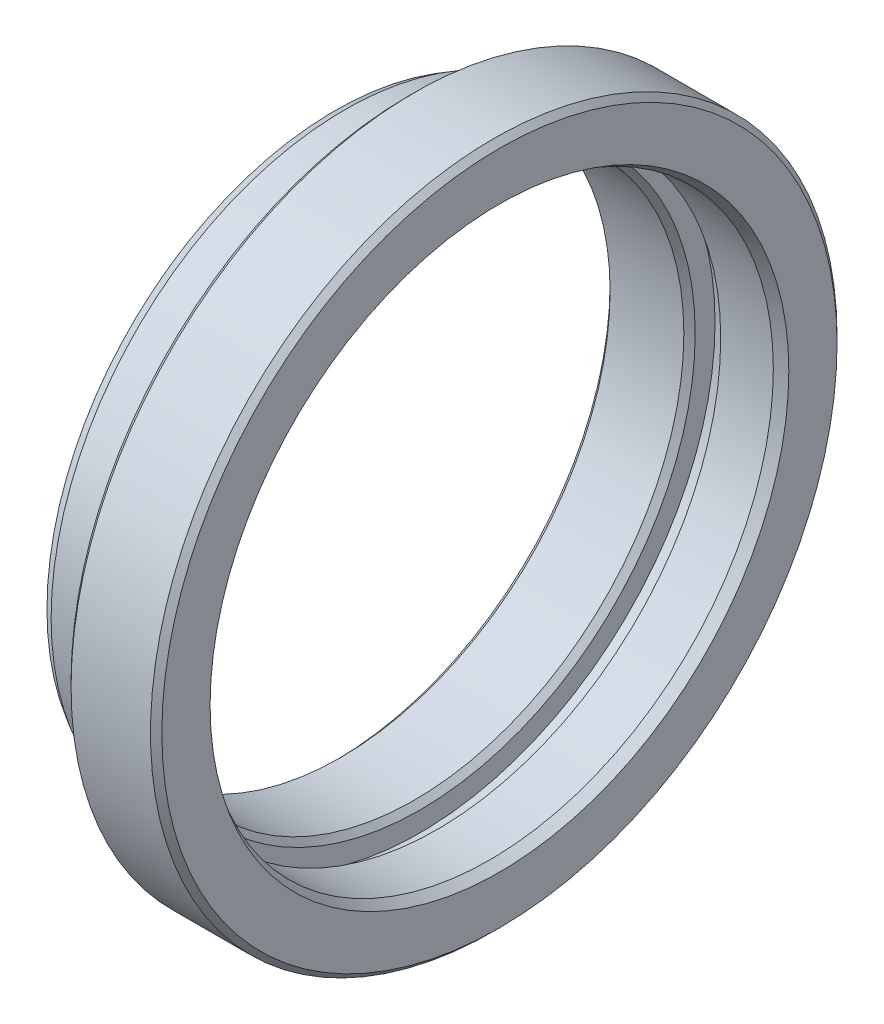
ISO-10303-21;
HEADER;
FILE_DESCRIPTION(('STEP AP214'),'2;1');
FILE_NAME('part.step','',(''),(''),'','','');
FILE_SCHEMA(('AUTOMOTIVE_DESIGN { 1 0 10303 214 1 1 1 1 }'));
ENDSEC;
DATA;
#1=APPLICATION_CONTEXT('core data for automotive mechanical design processes');
#2=APPLICATION_PROTOCOL_DEFINITION('international standard','automotive_design',2000,#1);
#3=PRODUCT_CONTEXT('',#1,'mechanical');
#4=PRODUCT('Part','Part','',(#3));
#5=PRODUCT_RELATED_PRODUCT_CATEGORY('part','',(#4));
#6=PRODUCT_DEFINITION_FORMATION('','',#4);
#7=PRODUCT_DEFINITION_CONTEXT('part definition',#1,'design');
#8=PRODUCT_DEFINITION('design','',#6,#7);
#9=PRODUCT_DEFINITION_SHAPE('','',#8);
#10=(LENGTH_UNIT() NAMED_UNIT(*) SI_UNIT(.MILLI.,.METRE.));
#11=(NAMED_UNIT(*) PLANE_ANGLE_UNIT() SI_UNIT($,.RADIAN.));
#12=(NAMED_UNIT(*) SI_UNIT($,.STERADIAN.) SOLID_ANGLE_UNIT());
#13=UNCERTAINTY_MEASURE_WITH_UNIT(LENGTH_MEASURE(1.E-05),#10,'distance_accuracy_value','');
#14=(GEOMETRIC_REPRESENTATION_CONTEXT(3) GLOBAL_UNCERTAINTY_ASSIGNED_CONTEXT((#13)) GLOBAL_UNIT_ASSIGNED_CONTEXT((#10,
#11,#12)) REPRESENTATION_CONTEXT('',''));
#15=CARTESIAN_POINT('',(0.,0.,0.));
#16=DIRECTION('',(0.,0.,1.));
#17=DIRECTION('',(1.,0.,0.));
#18=AXIS2_PLACEMENT_3D('',#15,#16,#17);
#19=CARTESIAN_POINT('',(0.,15.367,0.));
#20=DIRECTION('',(1.,0.,0.));
#21=DIRECTION('',(0.,0.,-1.));
#22=AXIS2_PLACEMENT_3D('',#19,#20,#21);
#23=PLANE('',#22);
#24=CARTESIAN_POINT('',(0.,0.,0.));
#25=DIRECTION('',(1.,0.,0.));
#26=DIRECTION('',(0.,0.,-1.));
#27=AXIS2_PLACEMENT_3D('',#24,#25,#26);
#28=CIRCLE('',#27,15.113);
#29=CARTESIAN_POINT('',(0.,0.,-15.113));
#30=VERTEX_POINT('',#29);
#31=EDGE_CURVE('E10',#30,#30,#28,.T.);
#32=ORIENTED_EDGE('',*,*,#31,.T.);
#33=EDGE_LOOP('',(#32));
#34=FACE_BOUND('',#33,.T.);
#35=CARTESIAN_POINT('',(0.,0.,0.));
#36=DIRECTION('',(1.,0.,0.));
#37=DIRECTION('',(0.,0.,-1.));
#38=AXIS2_PLACEMENT_3D('',#35,#36,#37);
#39=CIRCLE('',#38,12.954);
#40=CARTESIAN_POINT('',(0.,0.,-12.954));
#41=VERTEX_POINT('',#40);
#42=EDGE_CURVE('E52',#41,#41,#39,.F.);
#43=ORIENTED_EDGE('',*,*,#42,.T.);
#44=EDGE_LOOP('',(#43));
#45=FACE_BOUND('',#44,.T.);
#46=ADVANCED_FACE('F14',(#34,#45),#23,.T.);
#47=CARTESIAN_POINT('',(0.,0.,0.));
#48=DIRECTION('',(1.,0.,0.));
#49=DIRECTION('',(0.,0.,-1.));
#50=AXIS2_PLACEMENT_3D('',#47,#48,#49);
#51=CYLINDRICAL_SURFACE('',#50,15.367);
#52=CARTESIAN_POINT('',(-3.81,0.,0.));
#53=DIRECTION('',(-1.,0.,0.));
#54=DIRECTION('',(0.,0.,1.));
#55=AXIS2_PLACEMENT_3D('',#52,#53,#54);
#56=CIRCLE('',#55,15.367);
#57=CARTESIAN_POINT('',(-3.81,0.,15.367));
#58=VERTEX_POINT('',#57);
#59=EDGE_CURVE('E29',#58,#58,#56,.F.);
#60=ORIENTED_EDGE('',*,*,#59,.T.);
#61=EDGE_LOOP('',(#60));
#62=FACE_BOUND('',#61,.T.);
#63=CARTESIAN_POINT('',(-0.254000000000001,0.,0.));
#64=DIRECTION('',(1.,0.,0.));
#65=DIRECTION('',(0.,0.,-1.));
#66=AXIS2_PLACEMENT_3D('',#63,#64,#65);
#67=CIRCLE('',#66,15.367);
#68=CARTESIAN_POINT('',(-0.254000000000001,0.,-15.367));
#69=VERTEX_POINT('',#68);
#70=EDGE_CURVE('E34',#69,#69,#67,.F.);
#71=ORIENTED_EDGE('',*,*,#70,.T.);
#72=EDGE_LOOP('',(#71));
#73=FACE_BOUND('',#72,.T.);
#74=ADVANCED_FACE('F96',(#62,#73),#51,.T.);
#75=CARTESIAN_POINT('',(-4.064,15.367,0.));
#76=DIRECTION('',(-1.,0.,0.));
#77=DIRECTION('',(0.,0.,1.));
#78=AXIS2_PLACEMENT_3D('',#75,#76,#77);
#79=PLANE('',#78);
#80=CARTESIAN_POINT('',(-4.064,0.,0.));
#81=DIRECTION('',(-1.,0.,0.));
#82=DIRECTION('',(0.,0.,1.));
#83=AXIS2_PLACEMENT_3D('',#80,#81,#82);
#84=CIRCLE('',#83,15.113);
#85=CARTESIAN_POINT('',(-4.064,0.,15.113));
#86=VERTEX_POINT('',#85);
#87=EDGE_CURVE('E25',#86,#86,#84,.T.);
#88=ORIENTED_EDGE('',*,*,#87,.T.);
#89=EDGE_LOOP('',(#88));
#90=FACE_BOUND('',#89,.T.);
#91=CARTESIAN_POINT('',(-4.064,0.,0.));
#92=DIRECTION('',(1.,0.,0.));
#93=DIRECTION('',(0.,0.,-1.));
#94=AXIS2_PLACEMENT_3D('',#91,#92,#93);
#95=CIRCLE('',#94,12.6873);
#96=CARTESIAN_POINT('',(-4.064,0.,-12.6873));
#97=VERTEX_POINT('',#96);
#98=EDGE_CURVE('E58',#97,#97,#95,.T.);
#99=ORIENTED_EDGE('',*,*,#98,.T.);
#100=EDGE_LOOP('',(#99));
#101=FACE_BOUND('',#100,.T.);
#102=ADVANCED_FACE('F101',(#90,#101),#79,.T.);
#103=CARTESIAN_POINT('',(0.,0.,0.));
#104=DIRECTION('',(1.,0.,0.));
#105=DIRECTION('',(0.,0.,-1.));
#106=AXIS2_PLACEMENT_3D('',#103,#104,#105);
#107=CYLINDRICAL_SURFACE('',#106,12.6873);
#108=CARTESIAN_POINT('',(-4.826,0.,0.));
#109=DIRECTION('',(1.,0.,0.));
#110=DIRECTION('',(0.,0.,-1.));
#111=AXIS2_PLACEMENT_3D('',#108,#109,#110);
#112=CIRCLE('',#111,12.6873);
#113=CARTESIAN_POINT('',(-4.826,0.,-12.6873));
#114=VERTEX_POINT('',#113);
#115=EDGE_CURVE('E61',#114,#114,#112,.T.);
#116=ORIENTED_EDGE('',*,*,#115,.T.);
#117=EDGE_LOOP('',(#116));
#118=FACE_BOUND('',#117,.T.);
#119=ORIENTED_EDGE('',*,*,#98,.F.);
#120=EDGE_LOOP('',(#119));
#121=FACE_BOUND('',#120,.T.);
#122=ADVANCED_FACE('F149',(#118,#121),#107,.T.);
#123=CARTESIAN_POINT('',(-4.826,12.6873,0.));
#124=DIRECTION('',(1.,0.,0.));
#125=DIRECTION('',(0.,0.,-1.));
#126=AXIS2_PLACEMENT_3D('',#123,#124,#125);
#127=PLANE('',#126);
#128=CARTESIAN_POINT('',(-4.826,0.,0.));
#129=DIRECTION('',(1.,0.,0.));
#130=DIRECTION('',(0.,0.,-1.));
#131=AXIS2_PLACEMENT_3D('',#128,#129,#130);
#132=CIRCLE('',#131,13.1445);
#133=CARTESIAN_POINT('',(-4.826,0.,-13.1445));
#134=VERTEX_POINT('',#133);
#135=EDGE_CURVE('E64',#134,#134,#132,.T.);
#136=ORIENTED_EDGE('',*,*,#135,.T.);
#137=EDGE_LOOP('',(#136));
#138=FACE_BOUND('',#137,.T.);
#139=ORIENTED_EDGE('',*,*,#115,.F.);
#140=EDGE_LOOP('',(#139));
#141=FACE_BOUND('',#140,.T.);
#142=ADVANCED_FACE('F145',(#138,#141),#127,.T.);
#143=CARTESIAN_POINT('',(0.,0.,0.));
#144=DIRECTION('',(1.,0.,0.));
#145=DIRECTION('',(0.,0.,-1.));
#146=AXIS2_PLACEMENT_3D('',#143,#144,#145);
#147=CYLINDRICAL_SURFACE('',#146,13.1445);
#148=CARTESIAN_POINT('',(-6.9260590948775,0.,0.));
#149=DIRECTION('',(-1.,0.,0.));
#150=DIRECTION('',(0.,0.,1.));
#151=AXIS2_PLACEMENT_3D('',#148,#149,#150);
#152=CIRCLE('',#151,13.1445);
#153=CARTESIAN_POINT('',(-6.9260590948775,0.,13.1445));
#154=VERTEX_POINT('',#153);
#155=EDGE_CURVE('E49',#154,#154,#152,.F.);
#156=ORIENTED_EDGE('',*,*,#155,.T.);
#157=EDGE_LOOP('',(#156));
#158=FACE_BOUND('',#157,.T.);
#159=ORIENTED_EDGE('',*,*,#135,.F.);
#160=EDGE_LOOP('',(#159));
#161=FACE_BOUND('',#160,.T.);
#162=ADVANCED_FACE('F138',(#158,#161),#147,.T.);
#163=CARTESIAN_POINT('',(-7.366,13.1445,0.));
#164=DIRECTION('',(-1.,0.,0.));
#165=DIRECTION('',(0.,0.,1.));
#166=AXIS2_PLACEMENT_3D('',#163,#164,#165);
#167=PLANE('',#166);
#168=CARTESIAN_POINT('',(-7.366,0.,0.));
#169=DIRECTION('',(-1.,0.,0.));
#170=DIRECTION('',(0.,0.,1.));
#171=AXIS2_PLACEMENT_3D('',#168,#169,#170);
#172=CIRCLE('',#171,12.319);
#173=CARTESIAN_POINT('',(-7.366,0.,12.319));
#174=VERTEX_POINT('',#173);
#175=EDGE_CURVE('E43',#174,#174,#172,.F.);
#176=ORIENTED_EDGE('',*,*,#175,.T.);
#177=EDGE_LOOP('',(#176));
#178=FACE_BOUND('',#177,.T.);
#179=CARTESIAN_POINT('',(-7.366,0.,0.));
#180=DIRECTION('',(-1.,0.,0.));
#181=DIRECTION('',(0.,0.,1.));
#182=AXIS2_PLACEMENT_3D('',#179,#180,#181);
#183=CIRCLE('',#182,12.8905);
#184=CARTESIAN_POINT('',(-7.366,0.,12.8905));
#185=VERTEX_POINT('',#184);
#186=EDGE_CURVE('E46',#185,#185,#183,.T.);
#187=ORIENTED_EDGE('',*,*,#186,.T.);
#188=EDGE_LOOP('',(#187));
#189=FACE_BOUND('',#188,.T.);
#190=ADVANCED_FACE('F130',(#178,#189),#167,.T.);
#191=CARTESIAN_POINT('',(0.,0.,0.));
#192=DIRECTION('',(1.,0.,0.));
#193=DIRECTION('',(0.,0.,-1.));
#194=AXIS2_PLACEMENT_3D('',#191,#192,#193);
#195=CYLINDRICAL_SURFACE('',#194,12.065);
#196=CARTESIAN_POINT('',(-7.112,0.,0.));
#197=DIRECTION('',(-1.,0.,0.));
#198=DIRECTION('',(0.,0.,1.));
#199=AXIS2_PLACEMENT_3D('',#196,#197,#198);
#200=CIRCLE('',#199,12.065);
#201=CARTESIAN_POINT('',(-7.112,0.,12.065));
#202=VERTEX_POINT('',#201);
#203=EDGE_CURVE('E37',#202,#202,#200,.T.);
#204=ORIENTED_EDGE('',*,*,#203,.T.);
#205=EDGE_LOOP('',(#204));
#206=FACE_BOUND('',#205,.T.);
#207=CARTESIAN_POINT('',(-3.81,0.,0.));
#208=DIRECTION('',(1.,0.,0.));
#209=DIRECTION('',(0.,0.,-1.));
#210=AXIS2_PLACEMENT_3D('',#207,#208,#209);
#211=CIRCLE('',#210,12.065);
#212=CARTESIAN_POINT('',(-3.81,0.,-12.065));
#213=VERTEX_POINT('',#212);
#214=EDGE_CURVE('E40',#213,#213,#211,.T.);
#215=ORIENTED_EDGE('',*,*,#214,.T.);
#216=EDGE_LOOP('',(#215));
#217=FACE_BOUND('',#216,.T.);
#218=ADVANCED_FACE('F127',(#206,#217),#195,.F.);
#219=CARTESIAN_POINT('',(-3.556,12.065,0.));
#220=DIRECTION('',(1.,0.,0.));
#221=DIRECTION('',(0.,0.,-1.));
#222=AXIS2_PLACEMENT_3D('',#219,#220,#221);
#223=PLANE('',#222);
#224=CARTESIAN_POINT('',(-3.556,0.,0.));
#225=DIRECTION('',(1.,0.,0.));
#226=DIRECTION('',(0.,0.,-1.));
#227=AXIS2_PLACEMENT_3D('',#224,#225,#226);
#228=CIRCLE('',#227,12.319);
#229=CARTESIAN_POINT('',(-3.556,0.,-12.319));
#230=VERTEX_POINT('',#229);
#231=EDGE_CURVE('E21',#230,#230,#228,.F.);
#232=ORIENTED_EDGE('',*,*,#231,.T.);
#233=EDGE_LOOP('',(#232));
#234=FACE_BOUND('',#233,.T.);
#235=CARTESIAN_POINT('',(-3.556,0.,0.));
#236=DIRECTION('',(1.,0.,0.));
#237=DIRECTION('',(0.,0.,-1.));
#238=AXIS2_PLACEMENT_3D('',#235,#236,#237);
#239=CIRCLE('',#238,13.208);
#240=CARTESIAN_POINT('',(-3.556,0.,-13.208));
#241=VERTEX_POINT('',#240);
#242=EDGE_CURVE('E67',#241,#241,#239,.T.);
#243=ORIENTED_EDGE('',*,*,#242,.T.);
#244=EDGE_LOOP('',(#243));
#245=FACE_BOUND('',#244,.T.);
#246=ADVANCED_FACE('F129',(#234,#245),#223,.T.);
#247=CARTESIAN_POINT('',(0.,0.,0.));
#248=DIRECTION('',(1.,0.,0.));
#249=DIRECTION('',(0.,0.,-1.));
#250=AXIS2_PLACEMENT_3D('',#247,#248,#249);
#251=CYLINDRICAL_SURFACE('',#250,13.208);
#252=CARTESIAN_POINT('',(-2.794,0.,0.));
#253=DIRECTION('',(1.,0.,0.));
#254=DIRECTION('',(0.,0.,-1.));
#255=AXIS2_PLACEMENT_3D('',#252,#253,#254);
#256=CIRCLE('',#255,13.208);
#257=CARTESIAN_POINT('',(-2.794,0.,-13.208));
#258=VERTEX_POINT('',#257);
#259=EDGE_CURVE('E70',#258,#258,#256,.T.);
#260=ORIENTED_EDGE('',*,*,#259,.T.);
#261=EDGE_LOOP('',(#260));
#262=FACE_BOUND('',#261,.T.);
#263=ORIENTED_EDGE('',*,*,#242,.F.);
#264=EDGE_LOOP('',(#263));
#265=FACE_BOUND('',#264,.T.);
#266=ADVANCED_FACE('F93',(#262,#265),#251,.F.);
#267=CARTESIAN_POINT('',(-2.794,13.208,0.));
#268=DIRECTION('',(-1.,0.,0.));
#269=DIRECTION('',(0.,0.,1.));
#270=AXIS2_PLACEMENT_3D('',#267,#268,#269);
#271=PLANE('',#270);
#272=CARTESIAN_POINT('',(-2.794,0.,0.));
#273=DIRECTION('',(1.,0.,0.));
#274=DIRECTION('',(0.,0.,-1.));
#275=AXIS2_PLACEMENT_3D('',#272,#273,#274);
#276=CIRCLE('',#275,12.7);
#277=CARTESIAN_POINT('',(-2.794,0.,-12.7));
#278=VERTEX_POINT('',#277);
#279=EDGE_CURVE('E73',#278,#278,#276,.T.);
#280=ORIENTED_EDGE('',*,*,#279,.T.);
#281=EDGE_LOOP('',(#280));
#282=FACE_BOUND('',#281,.T.);
#283=ORIENTED_EDGE('',*,*,#259,.F.);
#284=EDGE_LOOP('',(#283));
#285=FACE_BOUND('',#284,.T.);
#286=ADVANCED_FACE('F77',(#282,#285),#271,.T.);
#287=CARTESIAN_POINT('',(0.,0.,0.));
#288=DIRECTION('',(1.,0.,0.));
#289=DIRECTION('',(0.,0.,-1.));
#290=AXIS2_PLACEMENT_3D('',#287,#288,#289);
#291=CYLINDRICAL_SURFACE('',#290,12.7);
#292=CARTESIAN_POINT('',(-0.439940905122501,0.,0.));
#293=DIRECTION('',(1.,0.,0.));
#294=DIRECTION('',(0.,0.,-1.));
#295=AXIS2_PLACEMENT_3D('',#292,#293,#294);
#296=CIRCLE('',#295,12.7);
#297=CARTESIAN_POINT('',(-0.439940905122501,0.,-12.7));
#298=VERTEX_POINT('',#297);
#299=EDGE_CURVE('E55',#298,#298,#296,.T.);
#300=ORIENTED_EDGE('',*,*,#299,.T.);
#301=EDGE_LOOP('',(#300));
#302=FACE_BOUND('',#301,.T.);
#303=ORIENTED_EDGE('',*,*,#279,.F.);
#304=EDGE_LOOP('',(#303));
#305=FACE_BOUND('',#304,.T.);
#306=ADVANCED_FACE('F80',(#302,#305),#291,.F.);
#307=CARTESIAN_POINT('',(-0.439940905122501,0.,0.));
#308=DIRECTION('',(1.,0.,0.));
#309=DIRECTION('',(0.,0.,-1.));
#310=AXIS2_PLACEMENT_3D('',#307,#308,#309);
#311=CONICAL_SURFACE('',#310,12.7,0.5235987755983);
#312=ORIENTED_EDGE('',*,*,#42,.F.);
#313=EDGE_LOOP('',(#312));
#314=FACE_BOUND('',#313,.T.);
#315=ORIENTED_EDGE('',*,*,#299,.F.);
#316=EDGE_LOOP('',(#315));
#317=FACE_BOUND('',#316,.T.);
#318=ADVANCED_FACE('F82',(#314,#317),#311,.F.);
#319=CARTESIAN_POINT('',(-6.9260590948775,0.,0.));
#320=DIRECTION('',(1.,0.,0.));
#321=DIRECTION('',(0.,0.,-1.));
#322=AXIS2_PLACEMENT_3D('',#319,#320,#321);
#323=CONICAL_SURFACE('',#322,13.1445,0.523598775598297);
#324=ORIENTED_EDGE('',*,*,#186,.F.);
#325=EDGE_LOOP('',(#324));
#326=FACE_BOUND('',#325,.T.);
#327=ORIENTED_EDGE('',*,*,#155,.F.);
#328=EDGE_LOOP('',(#327));
#329=FACE_BOUND('',#328,.T.);
#330=ADVANCED_FACE('F90',(#326,#329),#323,.T.);
#331=CARTESIAN_POINT('',(-7.366,0.,0.));
#332=DIRECTION('',(-1.,0.,0.));
#333=DIRECTION('',(0.,0.,1.));
#334=AXIS2_PLACEMENT_3D('',#331,#332,#333);
#335=CONICAL_SURFACE('',#334,12.319,0.785398163397452);
#336=ORIENTED_EDGE('',*,*,#203,.F.);
#337=EDGE_LOOP('',(#336));
#338=FACE_BOUND('',#337,.T.);
#339=ORIENTED_EDGE('',*,*,#175,.F.);
#340=EDGE_LOOP('',(#339));
#341=FACE_BOUND('',#340,.T.);
#342=ADVANCED_FACE('F109',(#338,#341),#335,.F.);
#343=CARTESIAN_POINT('',(-3.81,0.,0.));
#344=DIRECTION('',(1.,0.,0.));
#345=DIRECTION('',(0.,0.,-1.));
#346=AXIS2_PLACEMENT_3D('',#343,#344,#345);
#347=CONICAL_SURFACE('',#346,15.367,0.785398163397452);
#348=ORIENTED_EDGE('',*,*,#87,.F.);
#349=EDGE_LOOP('',(#348));
#350=FACE_BOUND('',#349,.T.);
#351=ORIENTED_EDGE('',*,*,#59,.F.);
#352=EDGE_LOOP('',(#351));
#353=FACE_BOUND('',#352,.T.);
#354=ADVANCED_FACE('F113',(#350,#353),#347,.T.);
#355=CARTESIAN_POINT('',(-3.81,0.,0.));
#356=DIRECTION('',(1.,0.,0.));
#357=DIRECTION('',(0.,0.,-1.));
#358=AXIS2_PLACEMENT_3D('',#355,#356,#357);
#359=CONICAL_SURFACE('',#358,12.065,0.785398163397445);
#360=ORIENTED_EDGE('',*,*,#231,.F.);
#361=EDGE_LOOP('',(#360));
#362=FACE_BOUND('',#361,.T.);
#363=ORIENTED_EDGE('',*,*,#214,.F.);
#364=EDGE_LOOP('',(#363));
#365=FACE_BOUND('',#364,.T.);
#366=ADVANCED_FACE('F116',(#362,#365),#359,.F.);
#367=CARTESIAN_POINT('',(0.,0.,0.));
#368=DIRECTION('',(-1.,0.,0.));
#369=DIRECTION('',(0.,0.,1.));
#370=AXIS2_PLACEMENT_3D('',#367,#368,#369);
#371=CONICAL_SURFACE('',#370,15.113,0.785398163397459);
#372=ORIENTED_EDGE('',*,*,#70,.F.);
#373=EDGE_LOOP('',(#372));
#374=FACE_BOUND('',#373,.T.);
#375=ORIENTED_EDGE('',*,*,#31,.F.);
#376=EDGE_LOOP('',(#375));
#377=FACE_BOUND('',#376,.T.);
#378=ADVANCED_FACE('F16',(#374,#377),#371,.T.);
#379=CLOSED_SHELL('',(#46,#74,#102,#122,#142,#162,#190,#218,#246,#266,#286,#306,#318,#330,#342,
#354,#366,#378));
#380=MANIFOLD_SOLID_BREP('B1',#379);
#381=ADVANCED_BREP_SHAPE_REPRESENTATION('',(#18,#380),#14);
#382=SHAPE_DEFINITION_REPRESENTATION(#9,#381);
ENDSEC;
END-ISO-10303-21;
